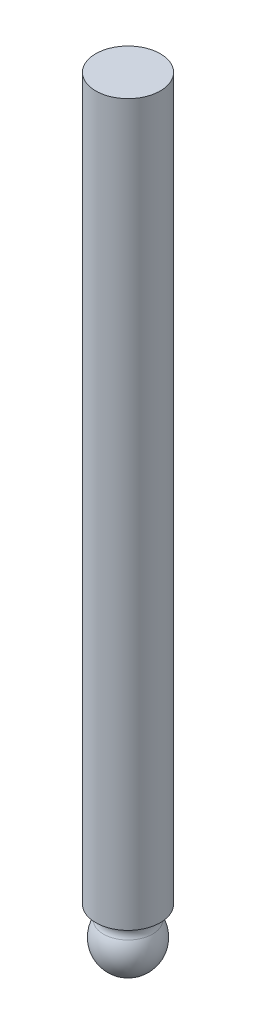
ISO-10303-21;
HEADER;
FILE_DESCRIPTION(('STEP AP214'),'2;1');
FILE_NAME('part.step','',(''),(''),'','','');
FILE_SCHEMA(('AUTOMOTIVE_DESIGN { 1 0 10303 214 1 1 1 1 }'));
ENDSEC;
DATA;
#1=APPLICATION_CONTEXT('core data for automotive mechanical design processes');
#2=APPLICATION_PROTOCOL_DEFINITION('international standard','automotive_design',2000,#1);
#3=PRODUCT_CONTEXT('',#1,'mechanical');
#4=PRODUCT('Part','Part','',(#3));
#5=PRODUCT_RELATED_PRODUCT_CATEGORY('part','',(#4));
#6=PRODUCT_DEFINITION_FORMATION('','',#4);
#7=PRODUCT_DEFINITION_CONTEXT('part definition',#1,'design');
#8=PRODUCT_DEFINITION('design','',#6,#7);
#9=PRODUCT_DEFINITION_SHAPE('','',#8);
#10=(LENGTH_UNIT() NAMED_UNIT(*) SI_UNIT(.MILLI.,.METRE.));
#11=(NAMED_UNIT(*) PLANE_ANGLE_UNIT() SI_UNIT($,.RADIAN.));
#12=(NAMED_UNIT(*) SI_UNIT($,.STERADIAN.) SOLID_ANGLE_UNIT());
#13=UNCERTAINTY_MEASURE_WITH_UNIT(LENGTH_MEASURE(1.E-05),#10,'distance_accuracy_value','');
#14=(GEOMETRIC_REPRESENTATION_CONTEXT(3) GLOBAL_UNCERTAINTY_ASSIGNED_CONTEXT((#13)) GLOBAL_UNIT_ASSIGNED_CONTEXT((#10,
#11,#12)) REPRESENTATION_CONTEXT('',''));
#15=CARTESIAN_POINT('',(0.,0.,0.));
#16=DIRECTION('',(0.,0.,1.));
#17=DIRECTION('',(1.,0.,0.));
#18=AXIS2_PLACEMENT_3D('',#15,#16,#17);
#19=CARTESIAN_POINT('',(0.,79.375,0.));
#20=DIRECTION('',(0.,-1.,0.));
#21=DIRECTION('',(0.,0.,-1.));
#22=AXIS2_PLACEMENT_3D('',#19,#20,#21);
#23=CYLINDRICAL_SURFACE('',#22,3.556);
#24=CARTESIAN_POINT('',(0.,79.375,0.));
#25=DIRECTION('',(0.,1.,0.));
#26=DIRECTION('',(0.,0.,1.));
#27=AXIS2_PLACEMENT_3D('',#24,#25,#26);
#28=CIRCLE('',#27,3.556);
#29=CARTESIAN_POINT('',(0.,79.375,-3.556));
#30=VERTEX_POINT('',#29);
#31=EDGE_CURVE('E10',#30,#30,#28,.T.);
#32=CARTESIAN_POINT('',(0.,0.,0.));
#33=DIRECTION('',(0.,1.,0.));
#34=DIRECTION('',(-1.,0.,0.));
#35=AXIS2_PLACEMENT_3D('',#32,#33,#34);
#36=CIRCLE('',#35,3.556);
#37=CARTESIAN_POINT('',(0.,0.,-3.556));
#38=VERTEX_POINT('',#37);
#39=EDGE_CURVE('E42',#38,#38,#36,.T.);
#40=CARTESIAN_POINT('',(0.,79.375,-3.556));
#41=CARTESIAN_POINT('',(0.,78.5481770833333,-3.556));
#42=CARTESIAN_POINT('',(0.,77.7213541666667,-3.556));
#43=CARTESIAN_POINT('',(0.,76.0677083333333,-3.556));
#44=CARTESIAN_POINT('',(0.,75.2408854166667,-3.556));
#45=CARTESIAN_POINT('',(0.,73.5872395833333,-3.556));
#46=CARTESIAN_POINT('',(0.,72.7604166666667,-3.556));
#47=CARTESIAN_POINT('',(0.,71.1067708333333,-3.556));
#48=CARTESIAN_POINT('',(0.,70.2799479166667,-3.556));
#49=CARTESIAN_POINT('',(0.,68.6263020833333,-3.556));
#50=CARTESIAN_POINT('',(0.,67.7994791666666,-3.556));
#51=CARTESIAN_POINT('',(0.,66.1458333333333,-3.556));
#52=CARTESIAN_POINT('',(0.,65.3190104166667,-3.556));
#53=CARTESIAN_POINT('',(0.,63.6653645833333,-3.556));
#54=CARTESIAN_POINT('',(0.,62.8385416666667,-3.556));
#55=CARTESIAN_POINT('',(0.,61.1848958333333,-3.556));
#56=CARTESIAN_POINT('',(0.,60.3580729166667,-3.556));
#57=CARTESIAN_POINT('',(0.,58.7044270833333,-3.556));
#58=CARTESIAN_POINT('',(0.,57.8776041666667,-3.556));
#59=CARTESIAN_POINT('',(0.,56.2239583333333,-3.556));
#60=CARTESIAN_POINT('',(0.,55.3971354166667,-3.556));
#61=CARTESIAN_POINT('',(0.,53.7434895833333,-3.556));
#62=CARTESIAN_POINT('',(0.,52.9166666666667,-3.556));
#63=CARTESIAN_POINT('',(0.,51.2630208333333,-3.556));
#64=CARTESIAN_POINT('',(0.,50.4361979166667,-3.556));
#65=CARTESIAN_POINT('',(0.,48.7825520833333,-3.556));
#66=CARTESIAN_POINT('',(0.,47.9557291666667,-3.556));
#67=CARTESIAN_POINT('',(0.,46.3020833333333,-3.556));
#68=CARTESIAN_POINT('',(0.,45.4752604166667,-3.556));
#69=CARTESIAN_POINT('',(0.,43.8216145833333,-3.556));
#70=CARTESIAN_POINT('',(0.,42.9947916666667,-3.556));
#71=CARTESIAN_POINT('',(0.,41.3411458333333,-3.556));
#72=CARTESIAN_POINT('',(0.,40.5143229166667,-3.556));
#73=CARTESIAN_POINT('',(0.,38.8606770833333,-3.556));
#74=CARTESIAN_POINT('',(0.,38.0338541666667,-3.556));
#75=CARTESIAN_POINT('',(0.,36.3802083333333,-3.556));
#76=CARTESIAN_POINT('',(0.,35.5533854166667,-3.556));
#77=CARTESIAN_POINT('',(0.,33.8997395833333,-3.556));
#78=CARTESIAN_POINT('',(0.,33.0729166666667,-3.556));
#79=CARTESIAN_POINT('',(0.,31.4192708333333,-3.556));
#80=CARTESIAN_POINT('',(0.,30.5924479166667,-3.556));
#81=CARTESIAN_POINT('',(0.,28.9388020833333,-3.556));
#82=CARTESIAN_POINT('',(0.,28.1119791666667,-3.556));
#83=CARTESIAN_POINT('',(0.,26.4583333333333,-3.556));
#84=CARTESIAN_POINT('',(0.,25.6315104166666,-3.556));
#85=CARTESIAN_POINT('',(0.,23.9778645833333,-3.556));
#86=CARTESIAN_POINT('',(0.,23.1510416666666,-3.556));
#87=CARTESIAN_POINT('',(0.,21.4973958333333,-3.556));
#88=CARTESIAN_POINT('',(0.,20.6705729166666,-3.556));
#89=CARTESIAN_POINT('',(0.,19.0169270833333,-3.556));
#90=CARTESIAN_POINT('',(0.,18.1901041666666,-3.556));
#91=CARTESIAN_POINT('',(0.,16.5364583333333,-3.556));
#92=CARTESIAN_POINT('',(0.,15.7096354166667,-3.556));
#93=CARTESIAN_POINT('',(0.,14.0559895833333,-3.556));
#94=CARTESIAN_POINT('',(0.,13.2291666666667,-3.556));
#95=CARTESIAN_POINT('',(0.,11.5755208333333,-3.556));
#96=CARTESIAN_POINT('',(0.,10.7486979166667,-3.556));
#97=CARTESIAN_POINT('',(0.,9.09505208333332,-3.556));
#98=CARTESIAN_POINT('',(0.,8.26822916666666,-3.556));
#99=CARTESIAN_POINT('',(0.,6.61458333333332,-3.556));
#100=CARTESIAN_POINT('',(0.,5.78776041666665,-3.556));
#101=CARTESIAN_POINT('',(0.,4.13411458333332,-3.556));
#102=CARTESIAN_POINT('',(0.,3.30729166666666,-3.556));
#103=CARTESIAN_POINT('',(0.,1.65364583333332,-3.556));
#104=CARTESIAN_POINT('',(0.,0.826822916666655,-3.556));
#105=CARTESIAN_POINT('',(0.,0.,-3.556));
#106=B_SPLINE_CURVE_WITH_KNOTS('',3,(#40,#41,#42,#43,#44,#45,#46,#47,#48,#49,#50,#51,#52,#53,
#54,#55,#56,#57,#58,#59,#60,#61,#62,#63,#64,#65,#66,#67,#68,#69,#70,#71,#72,#73,#74,#75,#76,#77,
#78,#79,#80,#81,#82,#83,#84,#85,#86,#87,#88,#89,#90,#91,#92,#93,#94,#95,#96,#97,#98,#99,#100,
#101,#102,#103,#104,#105),.UNSPECIFIED.,.F.,.F.,(4,2,2,2,2,2,2,2,2,2,2,2,2,2,2,2,2,2,2,2,2,2,2,
2,2,2,2,2,2,2,2,2,4),(0.,2.48046875000001,4.96093750000001,7.44140625,9.92187500000001,
12.40234375,14.8828125,17.36328125,19.84375,22.32421875,24.8046875,27.28515625,29.765625,
32.24609375,34.7265625,37.20703125,39.6875,42.16796875,44.6484375,47.12890625,49.609375,
52.08984375,54.5703125,57.05078125,59.53125,62.01171875,64.4921875,66.97265625,69.453125,
71.93359375,74.4140625,76.89453125,79.375),.UNSPECIFIED.);
#107=EDGE_CURVE('BSEAM32',#30,#38,#106,.T.);
#108=ORIENTED_EDGE('',*,*,#31,.F.);
#109=ORIENTED_EDGE('',*,*,#39,.T.);
#110=ORIENTED_EDGE('',*,*,#107,.T.);
#111=ORIENTED_EDGE('',*,*,#107,.F.);
#112=EDGE_LOOP('',(#108,#110,#109,#111));
#113=FACE_BOUND('',#112,.T.);
#114=ADVANCED_FACE('F32',(#113),#23,.T.);
#115=CARTESIAN_POINT('',(0.,79.375,0.));
#116=DIRECTION('',(0.,1.,0.));
#117=DIRECTION('',(0.,0.,1.));
#118=AXIS2_PLACEMENT_3D('',#115,#116,#117);
#119=PLANE('',#118);
#120=ORIENTED_EDGE('',*,*,#31,.T.);
#121=EDGE_LOOP('',(#120));
#122=FACE_BOUND('',#121,.T.);
#123=ADVANCED_FACE('F53',(#122),#119,.T.);
#124=CARTESIAN_POINT('',(0.,-0.995680000000001,0.));
#125=DIRECTION('',(0.,1.,0.));
#126=DIRECTION('',(-1.,0.,0.));
#127=AXIS2_PLACEMENT_3D('',#124,#125,#126);
#128=TOROIDAL_SURFACE('',#127,3.556,0.995680000000001);
#129=ORIENTED_EDGE('',*,*,#39,.F.);
#130=EDGE_LOOP('',(#129));
#131=FACE_BOUND('',#130,.T.);
#132=CARTESIAN_POINT('',(0.,-1.51595615103532,0.));
#133=DIRECTION('',(0.,1.,0.));
#134=DIRECTION('',(-1.,0.,0.));
#135=AXIS2_PLACEMENT_3D('',#132,#133,#134);
#136=CIRCLE('',#135,2.70706455542022);
#137=CARTESIAN_POINT('',(-2.70706455542022,-1.51595615103532,0.));
#138=VERTEX_POINT('',#137);
#139=EDGE_CURVE('E38',#138,#138,#136,.T.);
#140=ORIENTED_EDGE('',*,*,#139,.T.);
#141=EDGE_LOOP('',(#140));
#142=FACE_BOUND('',#141,.T.);
#143=ADVANCED_FACE('F50',(#131,#142),#128,.F.);
#144=CARTESIAN_POINT('',(0.,-3.175,0.));
#145=DIRECTION('',(0.,1.,0.));
#146=DIRECTION('',(1.,0.,0.));
#147=AXIS2_PLACEMENT_3D('',#144,#145,#146);
#148=SPHERICAL_SURFACE('',#147,3.175);
#149=ORIENTED_EDGE('',*,*,#139,.F.);
#150=EDGE_LOOP('',(#149));
#151=FACE_BOUND('',#150,.T.);
#152=ADVANCED_FACE('F52',(#151),#148,.T.);
#153=CLOSED_SHELL('',(#114,#123,#143,#152));
#154=MANIFOLD_SOLID_BREP('B2',#153);
#155=ADVANCED_BREP_SHAPE_REPRESENTATION('',(#18,#154),#14);
#156=SHAPE_DEFINITION_REPRESENTATION(#9,#155);
ENDSEC;
END-ISO-10303-21;
